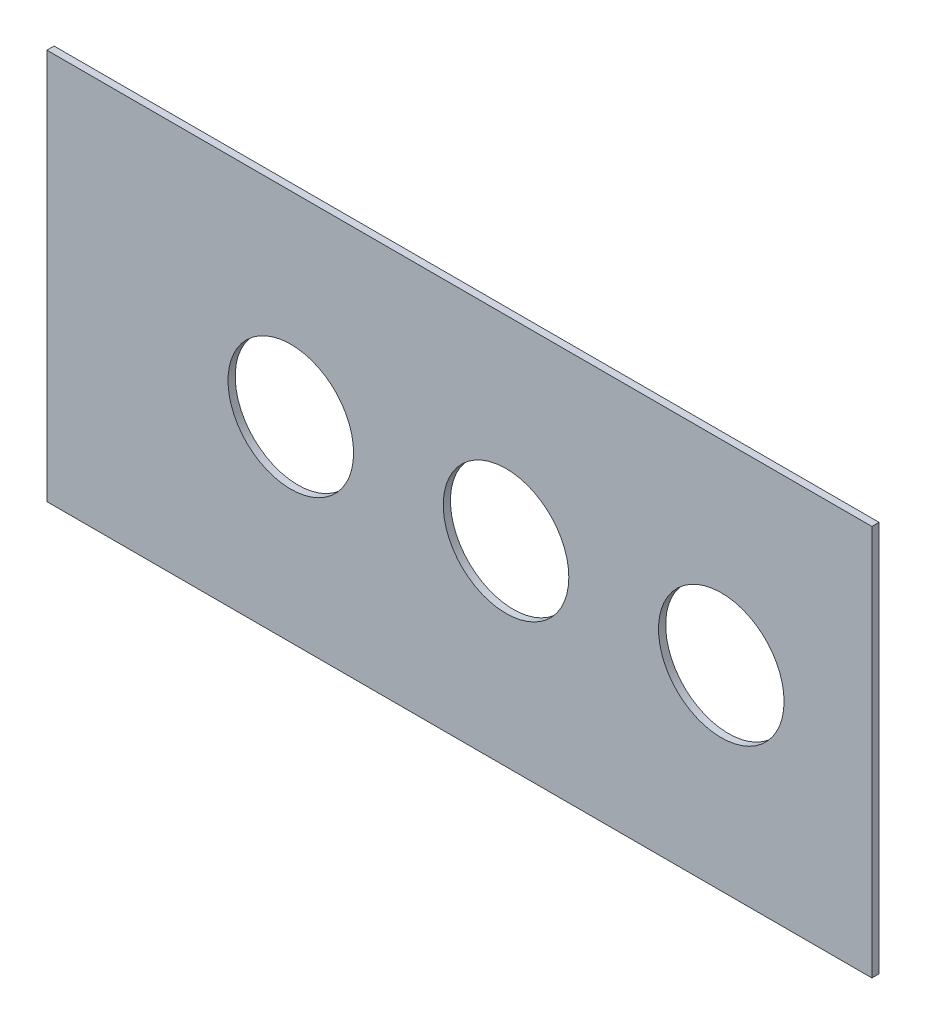
ISO-10303-21;
HEADER;
FILE_DESCRIPTION(('STEP AP214'),'2;1');
FILE_NAME('part.step','',(''),(''),'','','');
FILE_SCHEMA(('AUTOMOTIVE_DESIGN { 1 0 10303 214 1 1 1 1 }'));
ENDSEC;
DATA;
#1=APPLICATION_CONTEXT('core data for automotive mechanical design processes');
#2=APPLICATION_PROTOCOL_DEFINITION('international standard','automotive_design',2000,#1);
#3=PRODUCT_CONTEXT('',#1,'mechanical');
#4=PRODUCT('Part','Part','',(#3));
#5=PRODUCT_RELATED_PRODUCT_CATEGORY('part','',(#4));
#6=PRODUCT_DEFINITION_FORMATION('','',#4);
#7=PRODUCT_DEFINITION_CONTEXT('part definition',#1,'design');
#8=PRODUCT_DEFINITION('design','',#6,#7);
#9=PRODUCT_DEFINITION_SHAPE('','',#8);
#10=(LENGTH_UNIT() NAMED_UNIT(*) SI_UNIT(.MILLI.,.METRE.));
#11=(NAMED_UNIT(*) PLANE_ANGLE_UNIT() SI_UNIT($,.RADIAN.));
#12=(NAMED_UNIT(*) SI_UNIT($,.STERADIAN.) SOLID_ANGLE_UNIT());
#13=UNCERTAINTY_MEASURE_WITH_UNIT(LENGTH_MEASURE(1.E-05),#10,'distance_accuracy_value','');
#14=(GEOMETRIC_REPRESENTATION_CONTEXT(3) GLOBAL_UNCERTAINTY_ASSIGNED_CONTEXT((#13)) GLOBAL_UNIT_ASSIGNED_CONTEXT((#10,
#11,#12)) REPRESENTATION_CONTEXT('',''));
#15=CARTESIAN_POINT('',(0.,0.,0.));
#16=DIRECTION('',(0.,0.,1.));
#17=DIRECTION('',(1.,0.,0.));
#18=AXIS2_PLACEMENT_3D('',#15,#16,#17);
#19=CARTESIAN_POINT('',(0.,0.,10.));
#20=DIRECTION('',(0.,0.,1.));
#21=DIRECTION('',(1.,0.,0.));
#22=AXIS2_PLACEMENT_3D('',#19,#20,#21);
#23=PLANE('',#22);
#24=CARTESIAN_POINT('',(0.,0.,10.));
#25=DIRECTION('',(0.,0.,1.));
#26=DIRECTION('',(1.,0.,0.));
#27=AXIS2_PLACEMENT_3D('',#24,#25,#26);
#28=CIRCLE('',#27,87.5);
#29=CARTESIAN_POINT('',(87.5,0.,10.));
#30=VERTEX_POINT('',#29);
#31=EDGE_CURVE('E123',#30,#30,#28,.T.);
#32=ORIENTED_EDGE('',*,*,#31,.F.);
#33=EDGE_LOOP('',(#32));
#34=FACE_BOUND('',#33,.T.);
#35=DIRECTION('',(0.,-1.,0.));
#36=VECTOR('',#35,1.);
#37=CARTESIAN_POINT('',(-640.,272.5,10.));
#38=LINE('',#37,#36);
#39=CARTESIAN_POINT('',(-640.,272.5,10.));
#40=VERTEX_POINT('',#39);
#41=CARTESIAN_POINT('',(-640.,-272.5,10.));
#42=VERTEX_POINT('',#41);
#43=EDGE_CURVE('E93',#40,#42,#38,.T.);
#44=ORIENTED_EDGE('',*,*,#43,.T.);
#45=DIRECTION('',(1.,0.,0.));
#46=VECTOR('',#45,1.);
#47=CARTESIAN_POINT('',(-640.,-272.5,10.));
#48=LINE('',#47,#46);
#49=CARTESIAN_POINT('',(510.,-272.5,10.));
#50=VERTEX_POINT('',#49);
#51=EDGE_CURVE('E88',#42,#50,#48,.T.);
#52=ORIENTED_EDGE('',*,*,#51,.T.);
#53=DIRECTION('',(0.,1.,0.));
#54=VECTOR('',#53,1.);
#55=CARTESIAN_POINT('',(510.,272.5,10.));
#56=LINE('',#55,#54);
#57=CARTESIAN_POINT('',(510.,272.5,10.));
#58=VERTEX_POINT('',#57);
#59=EDGE_CURVE('E91',#50,#58,#56,.T.);
#60=ORIENTED_EDGE('',*,*,#59,.T.);
#61=DIRECTION('',(-1.,0.,0.));
#62=VECTOR('',#61,1.);
#63=CARTESIAN_POINT('',(-640.,272.5,10.));
#64=LINE('',#63,#62);
#65=EDGE_CURVE('E58',#58,#40,#64,.T.);
#66=ORIENTED_EDGE('',*,*,#65,.T.);
#67=EDGE_LOOP('',(#44,#52,#60,#66));
#68=FACE_BOUND('',#67,.T.);
#69=CARTESIAN_POINT('',(-300.,0.,10.));
#70=DIRECTION('',(0.,0.,1.));
#71=DIRECTION('',(1.,0.,0.));
#72=AXIS2_PLACEMENT_3D('',#69,#70,#71);
#73=CIRCLE('',#72,87.5);
#74=CARTESIAN_POINT('',(-212.5,0.,10.));
#75=VERTEX_POINT('',#74);
#76=EDGE_CURVE('E108',#75,#75,#73,.T.);
#77=ORIENTED_EDGE('',*,*,#76,.F.);
#78=EDGE_LOOP('',(#77));
#79=FACE_BOUND('',#78,.T.);
#80=CARTESIAN_POINT('',(300.,0.,10.));
#81=DIRECTION('',(0.,0.,1.));
#82=DIRECTION('',(1.,0.,0.));
#83=AXIS2_PLACEMENT_3D('',#80,#81,#82);
#84=CIRCLE('',#83,87.5);
#85=CARTESIAN_POINT('',(387.5,0.,10.));
#86=VERTEX_POINT('',#85);
#87=EDGE_CURVE('E129',#86,#86,#84,.T.);
#88=ORIENTED_EDGE('',*,*,#87,.F.);
#89=EDGE_LOOP('',(#88));
#90=FACE_BOUND('',#89,.T.);
#91=ADVANCED_FACE('F41',(#34,#68,#79,#90),#23,.T.);
#92=CARTESIAN_POINT('',(0.,0.,0.));
#93=DIRECTION('',(0.,0.,1.));
#94=DIRECTION('',(1.,0.,0.));
#95=AXIS2_PLACEMENT_3D('',#92,#93,#94);
#96=PLANE('',#95);
#97=DIRECTION('',(0.,-1.,0.));
#98=VECTOR('',#97,1.);
#99=CARTESIAN_POINT('',(-640.,272.5,0.));
#100=LINE('',#99,#98);
#101=CARTESIAN_POINT('',(-640.,272.5,0.));
#102=VERTEX_POINT('',#101);
#103=CARTESIAN_POINT('',(-640.,-272.5,0.));
#104=VERTEX_POINT('',#103);
#105=EDGE_CURVE('E105',#102,#104,#100,.T.);
#106=ORIENTED_EDGE('',*,*,#105,.F.);
#107=DIRECTION('',(-1.,0.,0.));
#108=VECTOR('',#107,1.);
#109=CARTESIAN_POINT('',(-640.,272.5,0.));
#110=LINE('',#109,#108);
#111=CARTESIAN_POINT('',(510.,272.5,0.));
#112=VERTEX_POINT('',#111);
#113=EDGE_CURVE('E81',#112,#102,#110,.T.);
#114=ORIENTED_EDGE('',*,*,#113,.F.);
#115=DIRECTION('',(0.,1.,0.));
#116=VECTOR('',#115,1.);
#117=CARTESIAN_POINT('',(510.,272.5,0.));
#118=LINE('',#117,#116);
#119=CARTESIAN_POINT('',(510.,-272.5,0.));
#120=VERTEX_POINT('',#119);
#121=EDGE_CURVE('E75',#120,#112,#118,.T.);
#122=ORIENTED_EDGE('',*,*,#121,.F.);
#123=DIRECTION('',(1.,0.,0.));
#124=VECTOR('',#123,1.);
#125=CARTESIAN_POINT('',(-640.,-272.5,0.));
#126=LINE('',#125,#124);
#127=EDGE_CURVE('E97',#104,#120,#126,.T.);
#128=ORIENTED_EDGE('',*,*,#127,.F.);
#129=EDGE_LOOP('',(#106,#114,#122,#128));
#130=FACE_BOUND('',#129,.T.);
#131=CARTESIAN_POINT('',(-300.,0.,0.));
#132=DIRECTION('',(0.,0.,1.));
#133=DIRECTION('',(1.,0.,0.));
#134=AXIS2_PLACEMENT_3D('',#131,#132,#133);
#135=CIRCLE('',#134,87.5);
#136=CARTESIAN_POINT('',(-212.5,0.,0.));
#137=VERTEX_POINT('',#136);
#138=EDGE_CURVE('E120',#137,#137,#135,.T.);
#139=ORIENTED_EDGE('',*,*,#138,.T.);
#140=EDGE_LOOP('',(#139));
#141=FACE_BOUND('',#140,.T.);
#142=CARTESIAN_POINT('',(0.,0.,0.));
#143=DIRECTION('',(0.,0.,1.));
#144=DIRECTION('',(1.,0.,0.));
#145=AXIS2_PLACEMENT_3D('',#142,#143,#144);
#146=CIRCLE('',#145,87.5);
#147=CARTESIAN_POINT('',(87.5,0.,0.));
#148=VERTEX_POINT('',#147);
#149=EDGE_CURVE('E126',#148,#148,#146,.T.);
#150=ORIENTED_EDGE('',*,*,#149,.T.);
#151=EDGE_LOOP('',(#150));
#152=FACE_BOUND('',#151,.T.);
#153=CARTESIAN_POINT('',(300.,0.,0.));
#154=DIRECTION('',(0.,0.,1.));
#155=DIRECTION('',(1.,0.,0.));
#156=AXIS2_PLACEMENT_3D('',#153,#154,#155);
#157=CIRCLE('',#156,87.5);
#158=CARTESIAN_POINT('',(387.5,0.,0.));
#159=VERTEX_POINT('',#158);
#160=EDGE_CURVE('E132',#159,#159,#157,.T.);
#161=ORIENTED_EDGE('',*,*,#160,.T.);
#162=EDGE_LOOP('',(#161));
#163=FACE_BOUND('',#162,.T.);
#164=ADVANCED_FACE('F116',(#130,#141,#152,#163),#96,.F.);
#165=CARTESIAN_POINT('',(-640.,272.5,10.));
#166=DIRECTION('',(1.,0.,0.));
#167=DIRECTION('',(0.,1.,0.));
#168=AXIS2_PLACEMENT_3D('',#165,#166,#167);
#169=PLANE('',#168);
#170=ORIENTED_EDGE('',*,*,#105,.T.);
#171=DIRECTION('',(0.,0.,-1.));
#172=VECTOR('',#171,1.);
#173=CARTESIAN_POINT('',(-640.,-272.5,10.));
#174=LINE('',#173,#172);
#175=EDGE_CURVE('E11',#42,#104,#174,.T.);
#176=ORIENTED_EDGE('',*,*,#175,.F.);
#177=ORIENTED_EDGE('',*,*,#43,.F.);
#178=DIRECTION('',(0.,0.,-1.));
#179=VECTOR('',#178,1.);
#180=CARTESIAN_POINT('',(-640.,272.5,10.));
#181=LINE('',#180,#179);
#182=EDGE_CURVE('E101',#40,#102,#181,.T.);
#183=ORIENTED_EDGE('',*,*,#182,.T.);
#184=EDGE_LOOP('',(#170,#176,#177,#183));
#185=FACE_BOUND('',#184,.T.);
#186=ADVANCED_FACE('F43',(#185),#169,.F.);
#187=CARTESIAN_POINT('',(-640.,-272.5,10.));
#188=DIRECTION('',(0.,1.,0.));
#189=DIRECTION('',(0.,0.,1.));
#190=AXIS2_PLACEMENT_3D('',#187,#188,#189);
#191=PLANE('',#190);
#192=ORIENTED_EDGE('',*,*,#127,.T.);
#193=DIRECTION('',(0.,0.,-1.));
#194=VECTOR('',#193,1.);
#195=CARTESIAN_POINT('',(510.,-272.5,10.));
#196=LINE('',#195,#194);
#197=EDGE_CURVE('E50',#50,#120,#196,.T.);
#198=ORIENTED_EDGE('',*,*,#197,.F.);
#199=ORIENTED_EDGE('',*,*,#51,.F.);
#200=ORIENTED_EDGE('',*,*,#175,.T.);
#201=EDGE_LOOP('',(#192,#198,#199,#200));
#202=FACE_BOUND('',#201,.T.);
#203=ADVANCED_FACE('F96',(#202),#191,.F.);
#204=CARTESIAN_POINT('',(510.,272.5,10.));
#205=DIRECTION('',(-1.,0.,0.));
#206=DIRECTION('',(0.,0.,1.));
#207=AXIS2_PLACEMENT_3D('',#204,#205,#206);
#208=PLANE('',#207);
#209=ORIENTED_EDGE('',*,*,#121,.T.);
#210=DIRECTION('',(0.,0.,-1.));
#211=VECTOR('',#210,1.);
#212=CARTESIAN_POINT('',(510.,272.5,10.));
#213=LINE('',#212,#211);
#214=EDGE_CURVE('E98',#58,#112,#213,.T.);
#215=ORIENTED_EDGE('',*,*,#214,.F.);
#216=ORIENTED_EDGE('',*,*,#59,.F.);
#217=ORIENTED_EDGE('',*,*,#197,.T.);
#218=EDGE_LOOP('',(#209,#215,#216,#217));
#219=FACE_BOUND('',#218,.T.);
#220=ADVANCED_FACE('F99',(#219),#208,.F.);
#221=CARTESIAN_POINT('',(-640.,272.5,10.));
#222=DIRECTION('',(0.,-1.,0.));
#223=DIRECTION('',(0.,0.,-1.));
#224=AXIS2_PLACEMENT_3D('',#221,#222,#223);
#225=PLANE('',#224);
#226=ORIENTED_EDGE('',*,*,#113,.T.);
#227=ORIENTED_EDGE('',*,*,#182,.F.);
#228=ORIENTED_EDGE('',*,*,#65,.F.);
#229=ORIENTED_EDGE('',*,*,#214,.T.);
#230=EDGE_LOOP('',(#226,#227,#228,#229));
#231=FACE_BOUND('',#230,.T.);
#232=ADVANCED_FACE('F113',(#231),#225,.F.);
#233=CARTESIAN_POINT('',(-300.,0.,10.));
#234=DIRECTION('',(0.,0.,-1.));
#235=DIRECTION('',(-1.,0.,0.));
#236=AXIS2_PLACEMENT_3D('',#233,#234,#235);
#237=CYLINDRICAL_SURFACE('',#236,87.5);
#238=ORIENTED_EDGE('',*,*,#76,.T.);
#239=EDGE_LOOP('',(#238));
#240=FACE_BOUND('',#239,.T.);
#241=ORIENTED_EDGE('',*,*,#138,.F.);
#242=EDGE_LOOP('',(#241));
#243=FACE_BOUND('',#242,.T.);
#244=ADVANCED_FACE('F150',(#240,#243),#237,.F.);
#245=CARTESIAN_POINT('',(0.,0.,10.));
#246=DIRECTION('',(0.,0.,-1.));
#247=DIRECTION('',(-1.,0.,0.));
#248=AXIS2_PLACEMENT_3D('',#245,#246,#247);
#249=CYLINDRICAL_SURFACE('',#248,87.5);
#250=ORIENTED_EDGE('',*,*,#31,.T.);
#251=EDGE_LOOP('',(#250));
#252=FACE_BOUND('',#251,.T.);
#253=ORIENTED_EDGE('',*,*,#149,.F.);
#254=EDGE_LOOP('',(#253));
#255=FACE_BOUND('',#254,.T.);
#256=ADVANCED_FACE('F204',(#252,#255),#249,.F.);
#257=CARTESIAN_POINT('',(300.,0.,10.));
#258=DIRECTION('',(0.,0.,-1.));
#259=DIRECTION('',(-1.,0.,0.));
#260=AXIS2_PLACEMENT_3D('',#257,#258,#259);
#261=CYLINDRICAL_SURFACE('',#260,87.5);
#262=ORIENTED_EDGE('',*,*,#87,.T.);
#263=EDGE_LOOP('',(#262));
#264=FACE_BOUND('',#263,.T.);
#265=ORIENTED_EDGE('',*,*,#160,.F.);
#266=EDGE_LOOP('',(#265));
#267=FACE_BOUND('',#266,.T.);
#268=ADVANCED_FACE('F138',(#264,#267),#261,.F.);
#269=CLOSED_SHELL('',(#91,#164,#186,#203,#220,#232,#244,#256,#268));
#270=MANIFOLD_SOLID_BREP('B2',#269);
#271=ADVANCED_BREP_SHAPE_REPRESENTATION('',(#18,#270),#14);
#272=SHAPE_DEFINITION_REPRESENTATION(#9,#271);
ENDSEC;
END-ISO-10303-21;
